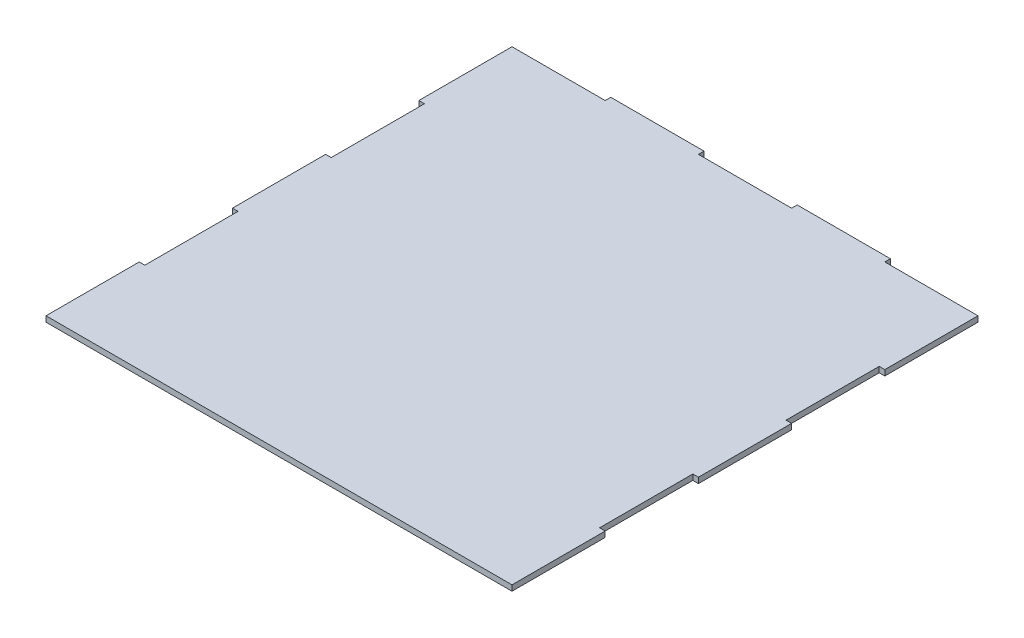
ISO-10303-21;
HEADER;
FILE_DESCRIPTION(('STEP AP214'),'2;1');
FILE_NAME('part.step','',(''),(''),'','','');
FILE_SCHEMA(('AUTOMOTIVE_DESIGN { 1 0 10303 214 1 1 1 1 }'));
ENDSEC;
DATA;
#1=APPLICATION_CONTEXT('core data for automotive mechanical design processes');
#2=APPLICATION_PROTOCOL_DEFINITION('international standard','automotive_design',2000,#1);
#3=PRODUCT_CONTEXT('',#1,'mechanical');
#4=PRODUCT('Part','Part','',(#3));
#5=PRODUCT_RELATED_PRODUCT_CATEGORY('part','',(#4));
#6=PRODUCT_DEFINITION_FORMATION('','',#4);
#7=PRODUCT_DEFINITION_CONTEXT('part definition',#1,'design');
#8=PRODUCT_DEFINITION('design','',#6,#7);
#9=PRODUCT_DEFINITION_SHAPE('','',#8);
#10=(LENGTH_UNIT() NAMED_UNIT(*) SI_UNIT(.MILLI.,.METRE.));
#11=(NAMED_UNIT(*) PLANE_ANGLE_UNIT() SI_UNIT($,.RADIAN.));
#12=(NAMED_UNIT(*) SI_UNIT($,.STERADIAN.) SOLID_ANGLE_UNIT());
#13=UNCERTAINTY_MEASURE_WITH_UNIT(LENGTH_MEASURE(1.E-05),#10,'distance_accuracy_value','');
#14=(GEOMETRIC_REPRESENTATION_CONTEXT(3) GLOBAL_UNCERTAINTY_ASSIGNED_CONTEXT((#13)) GLOBAL_UNIT_ASSIGNED_CONTEXT((#10,
#11,#12)) REPRESENTATION_CONTEXT('',''));
#15=CARTESIAN_POINT('',(0.,0.,0.));
#16=DIRECTION('',(0.,0.,1.));
#17=DIRECTION('',(1.,0.,0.));
#18=AXIS2_PLACEMENT_3D('',#15,#16,#17);
#19=CARTESIAN_POINT('',(0.,3.,0.));
#20=DIRECTION('',(1.,0.,0.));
#21=DIRECTION('',(0.,0.,-1.));
#22=AXIS2_PLACEMENT_3D('',#19,#20,#21);
#23=PLANE('',#22);
#24=DIRECTION('',(0.,0.,1.));
#25=VECTOR('',#24,1.);
#26=CARTESIAN_POINT('',(0.,0.,0.));
#27=LINE('',#26,#25);
#28=CARTESIAN_POINT('',(0.,0.,-50.));
#29=VERTEX_POINT('',#28);
#30=CARTESIAN_POINT('',(0.,0.,0.));
#31=VERTEX_POINT('',#30);
#32=EDGE_CURVE('E248',#29,#31,#27,.T.);
#33=ORIENTED_EDGE('',*,*,#32,.T.);
#34=DIRECTION('',(0.,-1.,0.));
#35=VECTOR('',#34,1.);
#36=CARTESIAN_POINT('',(0.,3.,0.));
#37=LINE('',#36,#35);
#38=CARTESIAN_POINT('',(0.,3.,0.));
#39=VERTEX_POINT('',#38);
#40=EDGE_CURVE('E11',#39,#31,#37,.T.);
#41=ORIENTED_EDGE('',*,*,#40,.F.);
#42=DIRECTION('',(0.,0.,1.));
#43=VECTOR('',#42,1.);
#44=CARTESIAN_POINT('',(0.,3.,0.));
#45=LINE('',#44,#43);
#46=CARTESIAN_POINT('',(0.,3.,-50.));
#47=VERTEX_POINT('',#46);
#48=EDGE_CURVE('E302',#47,#39,#45,.T.);
#49=ORIENTED_EDGE('',*,*,#48,.F.);
#50=DIRECTION('',(0.,-1.,0.));
#51=VECTOR('',#50,1.);
#52=CARTESIAN_POINT('',(0.,3.,-50.));
#53=LINE('',#52,#51);
#54=EDGE_CURVE('E244',#47,#29,#53,.T.);
#55=ORIENTED_EDGE('',*,*,#54,.T.);
#56=EDGE_LOOP('',(#33,#41,#49,#55));
#57=FACE_BOUND('',#56,.T.);
#58=ADVANCED_FACE('F32',(#57),#23,.F.);
#59=CARTESIAN_POINT('',(0.,3.,0.));
#60=DIRECTION('',(0.,0.,-1.));
#61=DIRECTION('',(-1.,0.,0.));
#62=AXIS2_PLACEMENT_3D('',#59,#60,#61);
#63=PLANE('',#62);
#64=DIRECTION('',(1.,0.,0.));
#65=VECTOR('',#64,1.);
#66=CARTESIAN_POINT('',(0.,0.,0.));
#67=LINE('',#66,#65);
#68=CARTESIAN_POINT('',(250.,0.,0.));
#69=VERTEX_POINT('',#68);
#70=EDGE_CURVE('E251',#31,#69,#67,.T.);
#71=ORIENTED_EDGE('',*,*,#70,.T.);
#72=DIRECTION('',(0.,-1.,0.));
#73=VECTOR('',#72,1.);
#74=CARTESIAN_POINT('',(250.,3.,0.));
#75=LINE('',#74,#73);
#76=CARTESIAN_POINT('',(250.,3.,0.));
#77=VERTEX_POINT('',#76);
#78=EDGE_CURVE('E40',#77,#69,#75,.T.);
#79=ORIENTED_EDGE('',*,*,#78,.F.);
#80=DIRECTION('',(1.,0.,0.));
#81=VECTOR('',#80,1.);
#82=CARTESIAN_POINT('',(0.,3.,0.));
#83=LINE('',#82,#81);
#84=EDGE_CURVE('E151',#39,#77,#83,.T.);
#85=ORIENTED_EDGE('',*,*,#84,.F.);
#86=ORIENTED_EDGE('',*,*,#40,.T.);
#87=EDGE_LOOP('',(#71,#79,#85,#86));
#88=FACE_BOUND('',#87,.T.);
#89=ADVANCED_FACE('F460',(#88),#63,.F.);
#90=CARTESIAN_POINT('',(250.,3.,0.));
#91=DIRECTION('',(-1.,0.,0.));
#92=DIRECTION('',(0.,0.,1.));
#93=AXIS2_PLACEMENT_3D('',#90,#91,#92);
#94=PLANE('',#93);
#95=DIRECTION('',(0.,0.,-1.));
#96=VECTOR('',#95,1.);
#97=CARTESIAN_POINT('',(250.,0.,0.));
#98=LINE('',#97,#96);
#99=CARTESIAN_POINT('',(250.,0.,-50.));
#100=VERTEX_POINT('',#99);
#101=EDGE_CURVE('E253',#69,#100,#98,.T.);
#102=ORIENTED_EDGE('',*,*,#101,.T.);
#103=DIRECTION('',(0.,-1.,0.));
#104=VECTOR('',#103,1.);
#105=CARTESIAN_POINT('',(250.,3.,-50.));
#106=LINE('',#105,#104);
#107=CARTESIAN_POINT('',(250.,3.,-50.));
#108=VERTEX_POINT('',#107);
#109=EDGE_CURVE('E369',#108,#100,#106,.T.);
#110=ORIENTED_EDGE('',*,*,#109,.F.);
#111=DIRECTION('',(0.,0.,-1.));
#112=VECTOR('',#111,1.);
#113=CARTESIAN_POINT('',(250.,3.,0.));
#114=LINE('',#113,#112);
#115=EDGE_CURVE('E377',#77,#108,#114,.T.);
#116=ORIENTED_EDGE('',*,*,#115,.F.);
#117=ORIENTED_EDGE('',*,*,#78,.T.);
#118=EDGE_LOOP('',(#102,#110,#116,#117));
#119=FACE_BOUND('',#118,.T.);
#120=ADVANCED_FACE('F375',(#119),#94,.F.);
#121=CARTESIAN_POINT('',(250.,3.,-50.));
#122=DIRECTION('',(0.,0.,1.));
#123=DIRECTION('',(1.,0.,0.));
#124=AXIS2_PLACEMENT_3D('',#121,#122,#123);
#125=PLANE('',#124);
#126=DIRECTION('',(-1.,0.,0.));
#127=VECTOR('',#126,1.);
#128=CARTESIAN_POINT('',(250.,0.,-50.));
#129=LINE('',#128,#127);
#130=CARTESIAN_POINT('',(247.,0.,-50.));
#131=VERTEX_POINT('',#130);
#132=EDGE_CURVE('E255',#100,#131,#129,.T.);
#133=ORIENTED_EDGE('',*,*,#132,.T.);
#134=DIRECTION('',(0.,-1.,0.));
#135=VECTOR('',#134,1.);
#136=CARTESIAN_POINT('',(247.,3.,-50.));
#137=LINE('',#136,#135);
#138=CARTESIAN_POINT('',(247.,3.,-50.));
#139=VERTEX_POINT('',#138);
#140=EDGE_CURVE('E366',#139,#131,#137,.T.);
#141=ORIENTED_EDGE('',*,*,#140,.F.);
#142=DIRECTION('',(-1.,0.,0.));
#143=VECTOR('',#142,1.);
#144=CARTESIAN_POINT('',(250.,3.,-50.));
#145=LINE('',#144,#143);
#146=EDGE_CURVE('E395',#108,#139,#145,.T.);
#147=ORIENTED_EDGE('',*,*,#146,.F.);
#148=ORIENTED_EDGE('',*,*,#109,.T.);
#149=EDGE_LOOP('',(#133,#141,#147,#148));
#150=FACE_BOUND('',#149,.T.);
#151=ADVANCED_FACE('F386',(#150),#125,.F.);
#152=CARTESIAN_POINT('',(247.,3.,-100.));
#153=DIRECTION('',(-1.,0.,0.));
#154=DIRECTION('',(0.,0.,1.));
#155=AXIS2_PLACEMENT_3D('',#152,#153,#154);
#156=PLANE('',#155);
#157=DIRECTION('',(0.,0.,-1.));
#158=VECTOR('',#157,1.);
#159=CARTESIAN_POINT('',(247.,0.,-100.));
#160=LINE('',#159,#158);
#161=CARTESIAN_POINT('',(247.,0.,-100.));
#162=VERTEX_POINT('',#161);
#163=EDGE_CURVE('E257',#131,#162,#160,.T.);
#164=ORIENTED_EDGE('',*,*,#163,.T.);
#165=DIRECTION('',(0.,-1.,0.));
#166=VECTOR('',#165,1.);
#167=CARTESIAN_POINT('',(247.,3.,-100.));
#168=LINE('',#167,#166);
#169=CARTESIAN_POINT('',(247.,3.,-100.));
#170=VERTEX_POINT('',#169);
#171=EDGE_CURVE('E363',#170,#162,#168,.T.);
#172=ORIENTED_EDGE('',*,*,#171,.F.);
#173=DIRECTION('',(0.,0.,-1.));
#174=VECTOR('',#173,1.);
#175=CARTESIAN_POINT('',(247.,3.,-100.));
#176=LINE('',#175,#174);
#177=EDGE_CURVE('E392',#139,#170,#176,.T.);
#178=ORIENTED_EDGE('',*,*,#177,.F.);
#179=ORIENTED_EDGE('',*,*,#140,.T.);
#180=EDGE_LOOP('',(#164,#172,#178,#179));
#181=FACE_BOUND('',#180,.T.);
#182=ADVANCED_FACE('F390',(#181),#156,.F.);
#183=CARTESIAN_POINT('',(250.,3.,-100.));
#184=DIRECTION('',(0.,0.,-1.));
#185=DIRECTION('',(-1.,0.,0.));
#186=AXIS2_PLACEMENT_3D('',#183,#184,#185);
#187=PLANE('',#186);
#188=DIRECTION('',(1.,0.,0.));
#189=VECTOR('',#188,1.);
#190=CARTESIAN_POINT('',(250.,0.,-100.));
#191=LINE('',#190,#189);
#192=CARTESIAN_POINT('',(250.,0.,-100.));
#193=VERTEX_POINT('',#192);
#194=EDGE_CURVE('E259',#162,#193,#191,.T.);
#195=ORIENTED_EDGE('',*,*,#194,.T.);
#196=DIRECTION('',(0.,-1.,0.));
#197=VECTOR('',#196,1.);
#198=CARTESIAN_POINT('',(250.,3.,-100.));
#199=LINE('',#198,#197);
#200=CARTESIAN_POINT('',(250.,3.,-100.));
#201=VERTEX_POINT('',#200);
#202=EDGE_CURVE('E360',#201,#193,#199,.T.);
#203=ORIENTED_EDGE('',*,*,#202,.F.);
#204=DIRECTION('',(1.,0.,0.));
#205=VECTOR('',#204,1.);
#206=CARTESIAN_POINT('',(250.,3.,-100.));
#207=LINE('',#206,#205);
#208=EDGE_CURVE('E394',#170,#201,#207,.T.);
#209=ORIENTED_EDGE('',*,*,#208,.F.);
#210=ORIENTED_EDGE('',*,*,#171,.T.);
#211=EDGE_LOOP('',(#195,#203,#209,#210));
#212=FACE_BOUND('',#211,.T.);
#213=ADVANCED_FACE('F473',(#212),#187,.F.);
#214=CARTESIAN_POINT('',(250.,3.,-100.));
#215=DIRECTION('',(-1.,0.,0.));
#216=DIRECTION('',(0.,0.,1.));
#217=AXIS2_PLACEMENT_3D('',#214,#215,#216);
#218=PLANE('',#217);
#219=DIRECTION('',(0.,0.,-1.));
#220=VECTOR('',#219,1.);
#221=CARTESIAN_POINT('',(250.,0.,-100.));
#222=LINE('',#221,#220);
#223=CARTESIAN_POINT('',(250.,0.,-150.));
#224=VERTEX_POINT('',#223);
#225=EDGE_CURVE('E261',#193,#224,#222,.T.);
#226=ORIENTED_EDGE('',*,*,#225,.T.);
#227=DIRECTION('',(0.,-1.,0.));
#228=VECTOR('',#227,1.);
#229=CARTESIAN_POINT('',(250.,3.,-150.));
#230=LINE('',#229,#228);
#231=CARTESIAN_POINT('',(250.,3.,-150.));
#232=VERTEX_POINT('',#231);
#233=EDGE_CURVE('E357',#232,#224,#230,.T.);
#234=ORIENTED_EDGE('',*,*,#233,.F.);
#235=DIRECTION('',(0.,0.,-1.));
#236=VECTOR('',#235,1.);
#237=CARTESIAN_POINT('',(250.,3.,-100.));
#238=LINE('',#237,#236);
#239=EDGE_CURVE('E397',#201,#232,#238,.T.);
#240=ORIENTED_EDGE('',*,*,#239,.F.);
#241=ORIENTED_EDGE('',*,*,#202,.T.);
#242=EDGE_LOOP('',(#226,#234,#240,#241));
#243=FACE_BOUND('',#242,.T.);
#244=ADVANCED_FACE('F476',(#243),#218,.F.);
#245=CARTESIAN_POINT('',(250.,3.,-150.));
#246=DIRECTION('',(0.,0.,1.));
#247=DIRECTION('',(1.,0.,0.));
#248=AXIS2_PLACEMENT_3D('',#245,#246,#247);
#249=PLANE('',#248);
#250=DIRECTION('',(-1.,0.,0.));
#251=VECTOR('',#250,1.);
#252=CARTESIAN_POINT('',(250.,0.,-150.));
#253=LINE('',#252,#251);
#254=CARTESIAN_POINT('',(247.,0.,-150.));
#255=VERTEX_POINT('',#254);
#256=EDGE_CURVE('E263',#224,#255,#253,.T.);
#257=ORIENTED_EDGE('',*,*,#256,.T.);
#258=DIRECTION('',(0.,-1.,0.));
#259=VECTOR('',#258,1.);
#260=CARTESIAN_POINT('',(247.,3.,-150.));
#261=LINE('',#260,#259);
#262=CARTESIAN_POINT('',(247.,3.,-150.));
#263=VERTEX_POINT('',#262);
#264=EDGE_CURVE('E354',#263,#255,#261,.T.);
#265=ORIENTED_EDGE('',*,*,#264,.F.);
#266=DIRECTION('',(-1.,0.,0.));
#267=VECTOR('',#266,1.);
#268=CARTESIAN_POINT('',(250.,3.,-150.));
#269=LINE('',#268,#267);
#270=EDGE_CURVE('E403',#232,#263,#269,.T.);
#271=ORIENTED_EDGE('',*,*,#270,.F.);
#272=ORIENTED_EDGE('',*,*,#233,.T.);
#273=EDGE_LOOP('',(#257,#265,#271,#272));
#274=FACE_BOUND('',#273,.T.);
#275=ADVANCED_FACE('F480',(#274),#249,.F.);
#276=CARTESIAN_POINT('',(247.,3.,-200.));
#277=DIRECTION('',(-1.,0.,0.));
#278=DIRECTION('',(0.,0.,1.));
#279=AXIS2_PLACEMENT_3D('',#276,#277,#278);
#280=PLANE('',#279);
#281=DIRECTION('',(0.,0.,-1.));
#282=VECTOR('',#281,1.);
#283=CARTESIAN_POINT('',(247.,0.,-200.));
#284=LINE('',#283,#282);
#285=CARTESIAN_POINT('',(247.,0.,-200.));
#286=VERTEX_POINT('',#285);
#287=EDGE_CURVE('E265',#255,#286,#284,.T.);
#288=ORIENTED_EDGE('',*,*,#287,.T.);
#289=DIRECTION('',(0.,-1.,0.));
#290=VECTOR('',#289,1.);
#291=CARTESIAN_POINT('',(247.,3.,-200.));
#292=LINE('',#291,#290);
#293=CARTESIAN_POINT('',(247.,3.,-200.));
#294=VERTEX_POINT('',#293);
#295=EDGE_CURVE('E351',#294,#286,#292,.T.);
#296=ORIENTED_EDGE('',*,*,#295,.F.);
#297=DIRECTION('',(0.,0.,-1.));
#298=VECTOR('',#297,1.);
#299=CARTESIAN_POINT('',(247.,3.,-200.));
#300=LINE('',#299,#298);
#301=EDGE_CURVE('E405',#263,#294,#300,.T.);
#302=ORIENTED_EDGE('',*,*,#301,.F.);
#303=ORIENTED_EDGE('',*,*,#264,.T.);
#304=EDGE_LOOP('',(#288,#296,#302,#303));
#305=FACE_BOUND('',#304,.T.);
#306=ADVANCED_FACE('F484',(#305),#280,.F.);
#307=CARTESIAN_POINT('',(250.,3.,-200.));
#308=DIRECTION('',(0.,0.,-1.));
#309=DIRECTION('',(-1.,0.,0.));
#310=AXIS2_PLACEMENT_3D('',#307,#308,#309);
#311=PLANE('',#310);
#312=DIRECTION('',(1.,0.,0.));
#313=VECTOR('',#312,1.);
#314=CARTESIAN_POINT('',(250.,0.,-200.));
#315=LINE('',#314,#313);
#316=CARTESIAN_POINT('',(250.,0.,-200.));
#317=VERTEX_POINT('',#316);
#318=EDGE_CURVE('E267',#286,#317,#315,.T.);
#319=ORIENTED_EDGE('',*,*,#318,.T.);
#320=DIRECTION('',(0.,-1.,0.));
#321=VECTOR('',#320,1.);
#322=CARTESIAN_POINT('',(250.,3.,-200.));
#323=LINE('',#322,#321);
#324=CARTESIAN_POINT('',(250.,3.,-200.));
#325=VERTEX_POINT('',#324);
#326=EDGE_CURVE('E348',#325,#317,#323,.T.);
#327=ORIENTED_EDGE('',*,*,#326,.F.);
#328=DIRECTION('',(1.,0.,0.));
#329=VECTOR('',#328,1.);
#330=CARTESIAN_POINT('',(250.,3.,-200.));
#331=LINE('',#330,#329);
#332=EDGE_CURVE('E407',#294,#325,#331,.T.);
#333=ORIENTED_EDGE('',*,*,#332,.F.);
#334=ORIENTED_EDGE('',*,*,#295,.T.);
#335=EDGE_LOOP('',(#319,#327,#333,#334));
#336=FACE_BOUND('',#335,.T.);
#337=ADVANCED_FACE('F488',(#336),#311,.F.);
#338=CARTESIAN_POINT('',(250.,3.,-200.));
#339=DIRECTION('',(-1.,0.,0.));
#340=DIRECTION('',(0.,0.,1.));
#341=AXIS2_PLACEMENT_3D('',#338,#339,#340);
#342=PLANE('',#341);
#343=DIRECTION('',(0.,0.,-1.));
#344=VECTOR('',#343,1.);
#345=CARTESIAN_POINT('',(250.,0.,-200.));
#346=LINE('',#345,#344);
#347=CARTESIAN_POINT('',(250.,0.,-250.));
#348=VERTEX_POINT('',#347);
#349=EDGE_CURVE('E269',#317,#348,#346,.T.);
#350=ORIENTED_EDGE('',*,*,#349,.T.);
#351=DIRECTION('',(0.,-1.,0.));
#352=VECTOR('',#351,1.);
#353=CARTESIAN_POINT('',(250.,3.,-250.));
#354=LINE('',#353,#352);
#355=CARTESIAN_POINT('',(250.,3.,-250.));
#356=VERTEX_POINT('',#355);
#357=EDGE_CURVE('E345',#356,#348,#354,.T.);
#358=ORIENTED_EDGE('',*,*,#357,.F.);
#359=DIRECTION('',(0.,0.,-1.));
#360=VECTOR('',#359,1.);
#361=CARTESIAN_POINT('',(250.,3.,-200.));
#362=LINE('',#361,#360);
#363=EDGE_CURVE('E409',#325,#356,#362,.T.);
#364=ORIENTED_EDGE('',*,*,#363,.F.);
#365=ORIENTED_EDGE('',*,*,#326,.T.);
#366=EDGE_LOOP('',(#350,#358,#364,#365));
#367=FACE_BOUND('',#366,.T.);
#368=ADVANCED_FACE('F492',(#367),#342,.F.);
#369=CARTESIAN_POINT('',(200.,3.,-250.));
#370=DIRECTION('',(0.,0.,1.));
#371=DIRECTION('',(1.,0.,0.));
#372=AXIS2_PLACEMENT_3D('',#369,#370,#371);
#373=PLANE('',#372);
#374=DIRECTION('',(-1.,0.,0.));
#375=VECTOR('',#374,1.);
#376=CARTESIAN_POINT('',(200.,0.,-250.));
#377=LINE('',#376,#375);
#378=CARTESIAN_POINT('',(200.,0.,-250.));
#379=VERTEX_POINT('',#378);
#380=EDGE_CURVE('E271',#348,#379,#377,.T.);
#381=ORIENTED_EDGE('',*,*,#380,.T.);
#382=DIRECTION('',(0.,-1.,0.));
#383=VECTOR('',#382,1.);
#384=CARTESIAN_POINT('',(200.,3.,-250.));
#385=LINE('',#384,#383);
#386=CARTESIAN_POINT('',(200.,3.,-250.));
#387=VERTEX_POINT('',#386);
#388=EDGE_CURVE('E342',#387,#379,#385,.T.);
#389=ORIENTED_EDGE('',*,*,#388,.F.);
#390=DIRECTION('',(-1.,0.,0.));
#391=VECTOR('',#390,1.);
#392=CARTESIAN_POINT('',(200.,3.,-250.));
#393=LINE('',#392,#391);
#394=EDGE_CURVE('E411',#356,#387,#393,.T.);
#395=ORIENTED_EDGE('',*,*,#394,.F.);
#396=ORIENTED_EDGE('',*,*,#357,.T.);
#397=EDGE_LOOP('',(#381,#389,#395,#396));
#398=FACE_BOUND('',#397,.T.);
#399=ADVANCED_FACE('F496',(#398),#373,.F.);
#400=CARTESIAN_POINT('',(200.,3.,-250.));
#401=DIRECTION('',(-1.,0.,0.));
#402=DIRECTION('',(0.,0.,1.));
#403=AXIS2_PLACEMENT_3D('',#400,#401,#402);
#404=PLANE('',#403);
#405=DIRECTION('',(0.,0.,-1.));
#406=VECTOR('',#405,1.);
#407=CARTESIAN_POINT('',(200.,0.,-250.));
#408=LINE('',#407,#406);
#409=CARTESIAN_POINT('',(200.,0.,-253.));
#410=VERTEX_POINT('',#409);
#411=EDGE_CURVE('E273',#379,#410,#408,.T.);
#412=ORIENTED_EDGE('',*,*,#411,.T.);
#413=DIRECTION('',(0.,-1.,0.));
#414=VECTOR('',#413,1.);
#415=CARTESIAN_POINT('',(200.,3.,-253.));
#416=LINE('',#415,#414);
#417=CARTESIAN_POINT('',(200.,3.,-253.));
#418=VERTEX_POINT('',#417);
#419=EDGE_CURVE('E339',#418,#410,#416,.T.);
#420=ORIENTED_EDGE('',*,*,#419,.F.);
#421=DIRECTION('',(0.,0.,-1.));
#422=VECTOR('',#421,1.);
#423=CARTESIAN_POINT('',(200.,3.,-250.));
#424=LINE('',#423,#422);
#425=EDGE_CURVE('E413',#387,#418,#424,.T.);
#426=ORIENTED_EDGE('',*,*,#425,.F.);
#427=ORIENTED_EDGE('',*,*,#388,.T.);
#428=EDGE_LOOP('',(#412,#420,#426,#427));
#429=FACE_BOUND('',#428,.T.);
#430=ADVANCED_FACE('F500',(#429),#404,.F.);
#431=CARTESIAN_POINT('',(150.,3.,-253.));
#432=DIRECTION('',(0.,0.,1.));
#433=DIRECTION('',(1.,0.,0.));
#434=AXIS2_PLACEMENT_3D('',#431,#432,#433);
#435=PLANE('',#434);
#436=DIRECTION('',(-1.,0.,0.));
#437=VECTOR('',#436,1.);
#438=CARTESIAN_POINT('',(150.,0.,-253.));
#439=LINE('',#438,#437);
#440=CARTESIAN_POINT('',(150.,0.,-253.));
#441=VERTEX_POINT('',#440);
#442=EDGE_CURVE('E275',#410,#441,#439,.T.);
#443=ORIENTED_EDGE('',*,*,#442,.T.);
#444=DIRECTION('',(0.,-1.,0.));
#445=VECTOR('',#444,1.);
#446=CARTESIAN_POINT('',(150.,3.,-253.));
#447=LINE('',#446,#445);
#448=CARTESIAN_POINT('',(150.,3.,-253.));
#449=VERTEX_POINT('',#448);
#450=EDGE_CURVE('E336',#449,#441,#447,.T.);
#451=ORIENTED_EDGE('',*,*,#450,.F.);
#452=DIRECTION('',(-1.,0.,0.));
#453=VECTOR('',#452,1.);
#454=CARTESIAN_POINT('',(150.,3.,-253.));
#455=LINE('',#454,#453);
#456=EDGE_CURVE('E415',#418,#449,#455,.T.);
#457=ORIENTED_EDGE('',*,*,#456,.F.);
#458=ORIENTED_EDGE('',*,*,#419,.T.);
#459=EDGE_LOOP('',(#443,#451,#457,#458));
#460=FACE_BOUND('',#459,.T.);
#461=ADVANCED_FACE('F504',(#460),#435,.F.);
#462=CARTESIAN_POINT('',(150.,3.,-250.));
#463=DIRECTION('',(1.,0.,0.));
#464=DIRECTION('',(0.,0.,-1.));
#465=AXIS2_PLACEMENT_3D('',#462,#463,#464);
#466=PLANE('',#465);
#467=DIRECTION('',(0.,0.,1.));
#468=VECTOR('',#467,1.);
#469=CARTESIAN_POINT('',(150.,0.,-250.));
#470=LINE('',#469,#468);
#471=CARTESIAN_POINT('',(150.,0.,-250.));
#472=VERTEX_POINT('',#471);
#473=EDGE_CURVE('E277',#441,#472,#470,.T.);
#474=ORIENTED_EDGE('',*,*,#473,.T.);
#475=DIRECTION('',(0.,-1.,0.));
#476=VECTOR('',#475,1.);
#477=CARTESIAN_POINT('',(150.,3.,-250.));
#478=LINE('',#477,#476);
#479=CARTESIAN_POINT('',(150.,3.,-250.));
#480=VERTEX_POINT('',#479);
#481=EDGE_CURVE('E333',#480,#472,#478,.T.);
#482=ORIENTED_EDGE('',*,*,#481,.F.);
#483=DIRECTION('',(0.,0.,1.));
#484=VECTOR('',#483,1.);
#485=CARTESIAN_POINT('',(150.,3.,-250.));
#486=LINE('',#485,#484);
#487=EDGE_CURVE('E417',#449,#480,#486,.T.);
#488=ORIENTED_EDGE('',*,*,#487,.F.);
#489=ORIENTED_EDGE('',*,*,#450,.T.);
#490=EDGE_LOOP('',(#474,#482,#488,#489));
#491=FACE_BOUND('',#490,.T.);
#492=ADVANCED_FACE('F508',(#491),#466,.F.);
#493=CARTESIAN_POINT('',(99.9999999999999,3.,-250.));
#494=DIRECTION('',(0.,0.,1.));
#495=DIRECTION('',(1.,0.,0.));
#496=AXIS2_PLACEMENT_3D('',#493,#494,#495);
#497=PLANE('',#496);
#498=DIRECTION('',(-1.,0.,0.));
#499=VECTOR('',#498,1.);
#500=CARTESIAN_POINT('',(99.9999999999999,0.,-250.));
#501=LINE('',#500,#499);
#502=CARTESIAN_POINT('',(99.9999999999999,0.,-250.));
#503=VERTEX_POINT('',#502);
#504=EDGE_CURVE('E279',#472,#503,#501,.T.);
#505=ORIENTED_EDGE('',*,*,#504,.T.);
#506=DIRECTION('',(0.,-1.,0.));
#507=VECTOR('',#506,1.);
#508=CARTESIAN_POINT('',(99.9999999999999,3.,-250.));
#509=LINE('',#508,#507);
#510=CARTESIAN_POINT('',(99.9999999999999,3.,-250.));
#511=VERTEX_POINT('',#510);
#512=EDGE_CURVE('E330',#511,#503,#509,.T.);
#513=ORIENTED_EDGE('',*,*,#512,.F.);
#514=DIRECTION('',(-1.,0.,0.));
#515=VECTOR('',#514,1.);
#516=CARTESIAN_POINT('',(99.9999999999999,3.,-250.));
#517=LINE('',#516,#515);
#518=EDGE_CURVE('E419',#480,#511,#517,.T.);
#519=ORIENTED_EDGE('',*,*,#518,.F.);
#520=ORIENTED_EDGE('',*,*,#481,.T.);
#521=EDGE_LOOP('',(#505,#513,#519,#520));
#522=FACE_BOUND('',#521,.T.);
#523=ADVANCED_FACE('F512',(#522),#497,.F.);
#524=CARTESIAN_POINT('',(99.9999999999999,3.,-250.));
#525=DIRECTION('',(-1.,0.,0.));
#526=DIRECTION('',(0.,0.,1.));
#527=AXIS2_PLACEMENT_3D('',#524,#525,#526);
#528=PLANE('',#527);
#529=DIRECTION('',(0.,0.,-1.));
#530=VECTOR('',#529,1.);
#531=CARTESIAN_POINT('',(99.9999999999999,0.,-250.));
#532=LINE('',#531,#530);
#533=CARTESIAN_POINT('',(99.9999999999999,0.,-253.));
#534=VERTEX_POINT('',#533);
#535=EDGE_CURVE('E281',#503,#534,#532,.T.);
#536=ORIENTED_EDGE('',*,*,#535,.T.);
#537=DIRECTION('',(0.,-1.,0.));
#538=VECTOR('',#537,1.);
#539=CARTESIAN_POINT('',(99.9999999999999,3.,-253.));
#540=LINE('',#539,#538);
#541=CARTESIAN_POINT('',(99.9999999999999,3.,-253.));
#542=VERTEX_POINT('',#541);
#543=EDGE_CURVE('E327',#542,#534,#540,.T.);
#544=ORIENTED_EDGE('',*,*,#543,.F.);
#545=DIRECTION('',(0.,0.,-1.));
#546=VECTOR('',#545,1.);
#547=CARTESIAN_POINT('',(99.9999999999999,3.,-250.));
#548=LINE('',#547,#546);
#549=EDGE_CURVE('E421',#511,#542,#548,.T.);
#550=ORIENTED_EDGE('',*,*,#549,.F.);
#551=ORIENTED_EDGE('',*,*,#512,.T.);
#552=EDGE_LOOP('',(#536,#544,#550,#551));
#553=FACE_BOUND('',#552,.T.);
#554=ADVANCED_FACE('F516',(#553),#528,.F.);
#555=CARTESIAN_POINT('',(50.,3.,-253.));
#556=DIRECTION('',(0.,0.,1.));
#557=DIRECTION('',(1.,0.,0.));
#558=AXIS2_PLACEMENT_3D('',#555,#556,#557);
#559=PLANE('',#558);
#560=DIRECTION('',(-1.,0.,0.));
#561=VECTOR('',#560,1.);
#562=CARTESIAN_POINT('',(50.,0.,-253.));
#563=LINE('',#562,#561);
#564=CARTESIAN_POINT('',(50.,0.,-253.));
#565=VERTEX_POINT('',#564);
#566=EDGE_CURVE('E283',#534,#565,#563,.T.);
#567=ORIENTED_EDGE('',*,*,#566,.T.);
#568=DIRECTION('',(0.,-1.,0.));
#569=VECTOR('',#568,1.);
#570=CARTESIAN_POINT('',(50.,3.,-253.));
#571=LINE('',#570,#569);
#572=CARTESIAN_POINT('',(50.,3.,-253.));
#573=VERTEX_POINT('',#572);
#574=EDGE_CURVE('E324',#573,#565,#571,.T.);
#575=ORIENTED_EDGE('',*,*,#574,.F.);
#576=DIRECTION('',(-1.,0.,0.));
#577=VECTOR('',#576,1.);
#578=CARTESIAN_POINT('',(50.,3.,-253.));
#579=LINE('',#578,#577);
#580=EDGE_CURVE('E423',#542,#573,#579,.T.);
#581=ORIENTED_EDGE('',*,*,#580,.F.);
#582=ORIENTED_EDGE('',*,*,#543,.T.);
#583=EDGE_LOOP('',(#567,#575,#581,#582));
#584=FACE_BOUND('',#583,.T.);
#585=ADVANCED_FACE('F520',(#584),#559,.F.);
#586=CARTESIAN_POINT('',(50.,3.,-250.));
#587=DIRECTION('',(1.,0.,0.));
#588=DIRECTION('',(0.,0.,-1.));
#589=AXIS2_PLACEMENT_3D('',#586,#587,#588);
#590=PLANE('',#589);
#591=DIRECTION('',(0.,0.,1.));
#592=VECTOR('',#591,1.);
#593=CARTESIAN_POINT('',(50.,0.,-250.));
#594=LINE('',#593,#592);
#595=CARTESIAN_POINT('',(50.,0.,-250.));
#596=VERTEX_POINT('',#595);
#597=EDGE_CURVE('E285',#565,#596,#594,.T.);
#598=ORIENTED_EDGE('',*,*,#597,.T.);
#599=DIRECTION('',(0.,-1.,0.));
#600=VECTOR('',#599,1.);
#601=CARTESIAN_POINT('',(50.,3.,-250.));
#602=LINE('',#601,#600);
#603=CARTESIAN_POINT('',(50.,3.,-250.));
#604=VERTEX_POINT('',#603);
#605=EDGE_CURVE('E321',#604,#596,#602,.T.);
#606=ORIENTED_EDGE('',*,*,#605,.F.);
#607=DIRECTION('',(0.,0.,1.));
#608=VECTOR('',#607,1.);
#609=CARTESIAN_POINT('',(50.,3.,-250.));
#610=LINE('',#609,#608);
#611=EDGE_CURVE('E425',#573,#604,#610,.T.);
#612=ORIENTED_EDGE('',*,*,#611,.F.);
#613=ORIENTED_EDGE('',*,*,#574,.T.);
#614=EDGE_LOOP('',(#598,#606,#612,#613));
#615=FACE_BOUND('',#614,.T.);
#616=ADVANCED_FACE('F524',(#615),#590,.F.);
#617=CARTESIAN_POINT('',(0.,3.,-250.));
#618=DIRECTION('',(0.,0.,1.));
#619=DIRECTION('',(1.,0.,0.));
#620=AXIS2_PLACEMENT_3D('',#617,#618,#619);
#621=PLANE('',#620);
#622=DIRECTION('',(-1.,0.,0.));
#623=VECTOR('',#622,1.);
#624=CARTESIAN_POINT('',(0.,0.,-250.));
#625=LINE('',#624,#623);
#626=CARTESIAN_POINT('',(0.,0.,-250.));
#627=VERTEX_POINT('',#626);
#628=EDGE_CURVE('E287',#596,#627,#625,.T.);
#629=ORIENTED_EDGE('',*,*,#628,.T.);
#630=DIRECTION('',(0.,-1.,0.));
#631=VECTOR('',#630,1.);
#632=CARTESIAN_POINT('',(0.,3.,-250.));
#633=LINE('',#632,#631);
#634=CARTESIAN_POINT('',(0.,3.,-250.));
#635=VERTEX_POINT('',#634);
#636=EDGE_CURVE('E318',#635,#627,#633,.T.);
#637=ORIENTED_EDGE('',*,*,#636,.F.);
#638=DIRECTION('',(-1.,0.,0.));
#639=VECTOR('',#638,1.);
#640=CARTESIAN_POINT('',(0.,3.,-250.));
#641=LINE('',#640,#639);
#642=EDGE_CURVE('E427',#604,#635,#641,.T.);
#643=ORIENTED_EDGE('',*,*,#642,.F.);
#644=ORIENTED_EDGE('',*,*,#605,.T.);
#645=EDGE_LOOP('',(#629,#637,#643,#644));
#646=FACE_BOUND('',#645,.T.);
#647=ADVANCED_FACE('F528',(#646),#621,.F.);
#648=CARTESIAN_POINT('',(0.,3.,-200.));
#649=DIRECTION('',(1.,0.,0.));
#650=DIRECTION('',(0.,0.,-1.));
#651=AXIS2_PLACEMENT_3D('',#648,#649,#650);
#652=PLANE('',#651);
#653=DIRECTION('',(0.,0.,1.));
#654=VECTOR('',#653,1.);
#655=CARTESIAN_POINT('',(0.,0.,-200.));
#656=LINE('',#655,#654);
#657=CARTESIAN_POINT('',(0.,0.,-200.));
#658=VERTEX_POINT('',#657);
#659=EDGE_CURVE('E289',#627,#658,#656,.T.);
#660=ORIENTED_EDGE('',*,*,#659,.T.);
#661=DIRECTION('',(0.,-1.,0.));
#662=VECTOR('',#661,1.);
#663=CARTESIAN_POINT('',(0.,3.,-200.));
#664=LINE('',#663,#662);
#665=CARTESIAN_POINT('',(0.,3.,-200.));
#666=VERTEX_POINT('',#665);
#667=EDGE_CURVE('E315',#666,#658,#664,.T.);
#668=ORIENTED_EDGE('',*,*,#667,.F.);
#669=DIRECTION('',(0.,0.,1.));
#670=VECTOR('',#669,1.);
#671=CARTESIAN_POINT('',(0.,3.,-200.));
#672=LINE('',#671,#670);
#673=EDGE_CURVE('E429',#635,#666,#672,.T.);
#674=ORIENTED_EDGE('',*,*,#673,.F.);
#675=ORIENTED_EDGE('',*,*,#636,.T.);
#676=EDGE_LOOP('',(#660,#668,#674,#675));
#677=FACE_BOUND('',#676,.T.);
#678=ADVANCED_FACE('F532',(#677),#652,.F.);
#679=CARTESIAN_POINT('',(0.,3.,-200.));
#680=DIRECTION('',(0.,0.,-1.));
#681=DIRECTION('',(-1.,0.,0.));
#682=AXIS2_PLACEMENT_3D('',#679,#680,#681);
#683=PLANE('',#682);
#684=DIRECTION('',(1.,0.,0.));
#685=VECTOR('',#684,1.);
#686=CARTESIAN_POINT('',(0.,0.,-200.));
#687=LINE('',#686,#685);
#688=CARTESIAN_POINT('',(3.00000000000003,0.,-200.));
#689=VERTEX_POINT('',#688);
#690=EDGE_CURVE('E291',#658,#689,#687,.T.);
#691=ORIENTED_EDGE('',*,*,#690,.T.);
#692=DIRECTION('',(0.,-1.,0.));
#693=VECTOR('',#692,1.);
#694=CARTESIAN_POINT('',(3.00000000000003,3.,-200.));
#695=LINE('',#694,#693);
#696=CARTESIAN_POINT('',(3.00000000000003,3.,-200.));
#697=VERTEX_POINT('',#696);
#698=EDGE_CURVE('E312',#697,#689,#695,.T.);
#699=ORIENTED_EDGE('',*,*,#698,.F.);
#700=DIRECTION('',(1.,0.,0.));
#701=VECTOR('',#700,1.);
#702=CARTESIAN_POINT('',(0.,3.,-200.));
#703=LINE('',#702,#701);
#704=EDGE_CURVE('E431',#666,#697,#703,.T.);
#705=ORIENTED_EDGE('',*,*,#704,.F.);
#706=ORIENTED_EDGE('',*,*,#667,.T.);
#707=EDGE_LOOP('',(#691,#699,#705,#706));
#708=FACE_BOUND('',#707,.T.);
#709=ADVANCED_FACE('F536',(#708),#683,.F.);
#710=CARTESIAN_POINT('',(3.00000000000003,3.,-200.));
#711=DIRECTION('',(1.,0.,0.));
#712=DIRECTION('',(0.,0.,-1.));
#713=AXIS2_PLACEMENT_3D('',#710,#711,#712);
#714=PLANE('',#713);
#715=DIRECTION('',(0.,0.,1.));
#716=VECTOR('',#715,1.);
#717=CARTESIAN_POINT('',(3.00000000000003,0.,-200.));
#718=LINE('',#717,#716);
#719=CARTESIAN_POINT('',(3.00000000000004,0.,-150.));
#720=VERTEX_POINT('',#719);
#721=EDGE_CURVE('E293',#689,#720,#718,.T.);
#722=ORIENTED_EDGE('',*,*,#721,.T.);
#723=DIRECTION('',(0.,-1.,0.));
#724=VECTOR('',#723,1.);
#725=CARTESIAN_POINT('',(3.00000000000004,3.,-150.));
#726=LINE('',#725,#724);
#727=CARTESIAN_POINT('',(3.00000000000004,3.,-150.));
#728=VERTEX_POINT('',#727);
#729=EDGE_CURVE('E309',#728,#720,#726,.T.);
#730=ORIENTED_EDGE('',*,*,#729,.F.);
#731=DIRECTION('',(0.,0.,1.));
#732=VECTOR('',#731,1.);
#733=CARTESIAN_POINT('',(3.00000000000003,3.,-200.));
#734=LINE('',#733,#732);
#735=EDGE_CURVE('E433',#697,#728,#734,.T.);
#736=ORIENTED_EDGE('',*,*,#735,.F.);
#737=ORIENTED_EDGE('',*,*,#698,.T.);
#738=EDGE_LOOP('',(#722,#730,#736,#737));
#739=FACE_BOUND('',#738,.T.);
#740=ADVANCED_FACE('F540',(#739),#714,.F.);
#741=CARTESIAN_POINT('',(0.,3.,-150.));
#742=DIRECTION('',(0.,0.,1.));
#743=DIRECTION('',(1.,0.,0.));
#744=AXIS2_PLACEMENT_3D('',#741,#742,#743);
#745=PLANE('',#744);
#746=DIRECTION('',(-1.,0.,0.));
#747=VECTOR('',#746,1.);
#748=CARTESIAN_POINT('',(0.,0.,-150.));
#749=LINE('',#748,#747);
#750=CARTESIAN_POINT('',(0.,0.,-150.));
#751=VERTEX_POINT('',#750);
#752=EDGE_CURVE('E295',#720,#751,#749,.T.);
#753=ORIENTED_EDGE('',*,*,#752,.T.);
#754=DIRECTION('',(0.,-1.,0.));
#755=VECTOR('',#754,1.);
#756=CARTESIAN_POINT('',(0.,3.,-150.));
#757=LINE('',#756,#755);
#758=CARTESIAN_POINT('',(0.,3.,-150.));
#759=VERTEX_POINT('',#758);
#760=EDGE_CURVE('E306',#759,#751,#757,.T.);
#761=ORIENTED_EDGE('',*,*,#760,.F.);
#762=DIRECTION('',(-1.,0.,0.));
#763=VECTOR('',#762,1.);
#764=CARTESIAN_POINT('',(0.,3.,-150.));
#765=LINE('',#764,#763);
#766=EDGE_CURVE('E435',#728,#759,#765,.T.);
#767=ORIENTED_EDGE('',*,*,#766,.F.);
#768=ORIENTED_EDGE('',*,*,#729,.T.);
#769=EDGE_LOOP('',(#753,#761,#767,#768));
#770=FACE_BOUND('',#769,.T.);
#771=ADVANCED_FACE('F441',(#770),#745,.F.);
#772=CARTESIAN_POINT('',(0.,3.,-100.));
#773=DIRECTION('',(1.,0.,0.));
#774=DIRECTION('',(0.,0.,-1.));
#775=AXIS2_PLACEMENT_3D('',#772,#773,#774);
#776=PLANE('',#775);
#777=DIRECTION('',(0.,0.,1.));
#778=VECTOR('',#777,1.);
#779=CARTESIAN_POINT('',(0.,0.,-100.));
#780=LINE('',#779,#778);
#781=CARTESIAN_POINT('',(0.,0.,-100.));
#782=VERTEX_POINT('',#781);
#783=EDGE_CURVE('E297',#751,#782,#780,.T.);
#784=ORIENTED_EDGE('',*,*,#783,.T.);
#785=DIRECTION('',(0.,-1.,0.));
#786=VECTOR('',#785,1.);
#787=CARTESIAN_POINT('',(0.,3.,-100.));
#788=LINE('',#787,#786);
#789=CARTESIAN_POINT('',(0.,3.,-100.));
#790=VERTEX_POINT('',#789);
#791=EDGE_CURVE('E239',#790,#782,#788,.T.);
#792=ORIENTED_EDGE('',*,*,#791,.F.);
#793=DIRECTION('',(0.,0.,1.));
#794=VECTOR('',#793,1.);
#795=CARTESIAN_POINT('',(0.,3.,-100.));
#796=LINE('',#795,#794);
#797=EDGE_CURVE('E230',#759,#790,#796,.T.);
#798=ORIENTED_EDGE('',*,*,#797,.F.);
#799=ORIENTED_EDGE('',*,*,#760,.T.);
#800=EDGE_LOOP('',(#784,#792,#798,#799));
#801=FACE_BOUND('',#800,.T.);
#802=ADVANCED_FACE('F445',(#801),#776,.F.);
#803=CARTESIAN_POINT('',(0.,3.,-100.));
#804=DIRECTION('',(0.,0.,-1.));
#805=DIRECTION('',(-1.,0.,0.));
#806=AXIS2_PLACEMENT_3D('',#803,#804,#805);
#807=PLANE('',#806);
#808=DIRECTION('',(1.,0.,0.));
#809=VECTOR('',#808,1.);
#810=CARTESIAN_POINT('',(0.,0.,-100.));
#811=LINE('',#810,#809);
#812=CARTESIAN_POINT('',(3.00000000000004,0.,-100.));
#813=VERTEX_POINT('',#812);
#814=EDGE_CURVE('E238',#782,#813,#811,.T.);
#815=ORIENTED_EDGE('',*,*,#814,.T.);
#816=DIRECTION('',(0.,-1.,0.));
#817=VECTOR('',#816,1.);
#818=CARTESIAN_POINT('',(3.00000000000004,3.,-100.));
#819=LINE('',#818,#817);
#820=CARTESIAN_POINT('',(3.00000000000004,3.,-100.));
#821=VERTEX_POINT('',#820);
#822=EDGE_CURVE('E235',#821,#813,#819,.T.);
#823=ORIENTED_EDGE('',*,*,#822,.F.);
#824=DIRECTION('',(1.,0.,0.));
#825=VECTOR('',#824,1.);
#826=CARTESIAN_POINT('',(0.,3.,-100.));
#827=LINE('',#826,#825);
#828=EDGE_CURVE('E224',#790,#821,#827,.T.);
#829=ORIENTED_EDGE('',*,*,#828,.F.);
#830=ORIENTED_EDGE('',*,*,#791,.T.);
#831=EDGE_LOOP('',(#815,#823,#829,#830));
#832=FACE_BOUND('',#831,.T.);
#833=ADVANCED_FACE('F236',(#832),#807,.F.);
#834=CARTESIAN_POINT('',(3.00000000000004,3.,-100.));
#835=DIRECTION('',(1.,0.,0.));
#836=DIRECTION('',(0.,0.,-1.));
#837=AXIS2_PLACEMENT_3D('',#834,#835,#836);
#838=PLANE('',#837);
#839=DIRECTION('',(0.,0.,1.));
#840=VECTOR('',#839,1.);
#841=CARTESIAN_POINT('',(3.00000000000004,0.,-100.));
#842=LINE('',#841,#840);
#843=CARTESIAN_POINT('',(3.00000000000005,0.,-50.));
#844=VERTEX_POINT('',#843);
#845=EDGE_CURVE('E137',#813,#844,#842,.T.);
#846=ORIENTED_EDGE('',*,*,#845,.T.);
#847=DIRECTION('',(0.,-1.,0.));
#848=VECTOR('',#847,1.);
#849=CARTESIAN_POINT('',(3.00000000000005,3.,-50.));
#850=LINE('',#849,#848);
#851=CARTESIAN_POINT('',(3.00000000000005,3.,-50.));
#852=VERTEX_POINT('',#851);
#853=EDGE_CURVE('E240',#852,#844,#850,.T.);
#854=ORIENTED_EDGE('',*,*,#853,.F.);
#855=DIRECTION('',(0.,0.,1.));
#856=VECTOR('',#855,1.);
#857=CARTESIAN_POINT('',(3.00000000000004,3.,-100.));
#858=LINE('',#857,#856);
#859=EDGE_CURVE('E228',#821,#852,#858,.T.);
#860=ORIENTED_EDGE('',*,*,#859,.F.);
#861=ORIENTED_EDGE('',*,*,#822,.T.);
#862=EDGE_LOOP('',(#846,#854,#860,#861));
#863=FACE_BOUND('',#862,.T.);
#864=ADVANCED_FACE('F242',(#863),#838,.F.);
#865=CARTESIAN_POINT('',(0.,3.,-50.));
#866=DIRECTION('',(0.,0.,1.));
#867=DIRECTION('',(1.,0.,0.));
#868=AXIS2_PLACEMENT_3D('',#865,#866,#867);
#869=PLANE('',#868);
#870=DIRECTION('',(-1.,0.,0.));
#871=VECTOR('',#870,1.);
#872=CARTESIAN_POINT('',(0.,0.,-50.));
#873=LINE('',#872,#871);
#874=EDGE_CURVE('E143',#844,#29,#873,.T.);
#875=ORIENTED_EDGE('',*,*,#874,.T.);
#876=ORIENTED_EDGE('',*,*,#54,.F.);
#877=DIRECTION('',(-1.,0.,0.));
#878=VECTOR('',#877,1.);
#879=CARTESIAN_POINT('',(0.,3.,-50.));
#880=LINE('',#879,#878);
#881=EDGE_CURVE('E48',#852,#47,#880,.T.);
#882=ORIENTED_EDGE('',*,*,#881,.F.);
#883=ORIENTED_EDGE('',*,*,#853,.T.);
#884=EDGE_LOOP('',(#875,#876,#882,#883));
#885=FACE_BOUND('',#884,.T.);
#886=ADVANCED_FACE('F449',(#885),#869,.F.);
#887=CARTESIAN_POINT('',(0.,3.,0.));
#888=DIRECTION('',(0.,-1.,0.));
#889=DIRECTION('',(0.,0.,-1.));
#890=AXIS2_PLACEMENT_3D('',#887,#888,#889);
#891=PLANE('',#890);
#892=ORIENTED_EDGE('',*,*,#48,.T.);
#893=ORIENTED_EDGE('',*,*,#84,.T.);
#894=ORIENTED_EDGE('',*,*,#115,.T.);
#895=ORIENTED_EDGE('',*,*,#146,.T.);
#896=ORIENTED_EDGE('',*,*,#177,.T.);
#897=ORIENTED_EDGE('',*,*,#208,.T.);
#898=ORIENTED_EDGE('',*,*,#239,.T.);
#899=ORIENTED_EDGE('',*,*,#270,.T.);
#900=ORIENTED_EDGE('',*,*,#301,.T.);
#901=ORIENTED_EDGE('',*,*,#332,.T.);
#902=ORIENTED_EDGE('',*,*,#363,.T.);
#903=ORIENTED_EDGE('',*,*,#394,.T.);
#904=ORIENTED_EDGE('',*,*,#425,.T.);
#905=ORIENTED_EDGE('',*,*,#456,.T.);
#906=ORIENTED_EDGE('',*,*,#487,.T.);
#907=ORIENTED_EDGE('',*,*,#518,.T.);
#908=ORIENTED_EDGE('',*,*,#549,.T.);
#909=ORIENTED_EDGE('',*,*,#580,.T.);
#910=ORIENTED_EDGE('',*,*,#611,.T.);
#911=ORIENTED_EDGE('',*,*,#642,.T.);
#912=ORIENTED_EDGE('',*,*,#673,.T.);
#913=ORIENTED_EDGE('',*,*,#704,.T.);
#914=ORIENTED_EDGE('',*,*,#735,.T.);
#915=ORIENTED_EDGE('',*,*,#766,.T.);
#916=ORIENTED_EDGE('',*,*,#797,.T.);
#917=ORIENTED_EDGE('',*,*,#828,.T.);
#918=ORIENTED_EDGE('',*,*,#859,.T.);
#919=ORIENTED_EDGE('',*,*,#881,.T.);
#920=EDGE_LOOP('',(#892,#893,#894,#895,#896,#897,#898,#899,#900,#901,#902,#903,#904,#905,#906,
#907,#908,#909,#910,#911,#912,#913,#914,#915,#916,#917,#918,#919));
#921=FACE_BOUND('',#920,.T.);
#922=ADVANCED_FACE('F226',(#921),#891,.F.);
#923=CARTESIAN_POINT('',(0.,0.,0.));
#924=DIRECTION('',(0.,-1.,0.));
#925=DIRECTION('',(0.,0.,-1.));
#926=AXIS2_PLACEMENT_3D('',#923,#924,#925);
#927=PLANE('',#926);
#928=ORIENTED_EDGE('',*,*,#32,.F.);
#929=ORIENTED_EDGE('',*,*,#874,.F.);
#930=ORIENTED_EDGE('',*,*,#845,.F.);
#931=ORIENTED_EDGE('',*,*,#814,.F.);
#932=ORIENTED_EDGE('',*,*,#783,.F.);
#933=ORIENTED_EDGE('',*,*,#752,.F.);
#934=ORIENTED_EDGE('',*,*,#721,.F.);
#935=ORIENTED_EDGE('',*,*,#690,.F.);
#936=ORIENTED_EDGE('',*,*,#659,.F.);
#937=ORIENTED_EDGE('',*,*,#628,.F.);
#938=ORIENTED_EDGE('',*,*,#597,.F.);
#939=ORIENTED_EDGE('',*,*,#566,.F.);
#940=ORIENTED_EDGE('',*,*,#535,.F.);
#941=ORIENTED_EDGE('',*,*,#504,.F.);
#942=ORIENTED_EDGE('',*,*,#473,.F.);
#943=ORIENTED_EDGE('',*,*,#442,.F.);
#944=ORIENTED_EDGE('',*,*,#411,.F.);
#945=ORIENTED_EDGE('',*,*,#380,.F.);
#946=ORIENTED_EDGE('',*,*,#349,.F.);
#947=ORIENTED_EDGE('',*,*,#318,.F.);
#948=ORIENTED_EDGE('',*,*,#287,.F.);
#949=ORIENTED_EDGE('',*,*,#256,.F.);
#950=ORIENTED_EDGE('',*,*,#225,.F.);
#951=ORIENTED_EDGE('',*,*,#194,.F.);
#952=ORIENTED_EDGE('',*,*,#163,.F.);
#953=ORIENTED_EDGE('',*,*,#132,.F.);
#954=ORIENTED_EDGE('',*,*,#101,.F.);
#955=ORIENTED_EDGE('',*,*,#70,.F.);
#956=EDGE_LOOP('',(#928,#929,#930,#931,#932,#933,#934,#935,#936,#937,#938,#939,#940,#941,#942,
#943,#944,#945,#946,#947,#948,#949,#950,#951,#952,#953,#954,#955));
#957=FACE_BOUND('',#956,.T.);
#958=ADVANCED_FACE('F381',(#957),#927,.T.);
#959=CLOSED_SHELL('',(#58,#89,#120,#151,#182,#213,#244,#275,#306,#337,#368,#399,#430,#461,#492,
#523,#554,#585,#616,#647,#678,#709,#740,#771,#802,#833,#864,#886,#922,#958));
#960=MANIFOLD_SOLID_BREP('B2',#959);
#961=ADVANCED_BREP_SHAPE_REPRESENTATION('',(#18,#960),#14);
#962=SHAPE_DEFINITION_REPRESENTATION(#9,#961);
ENDSEC;
END-ISO-10303-21;
